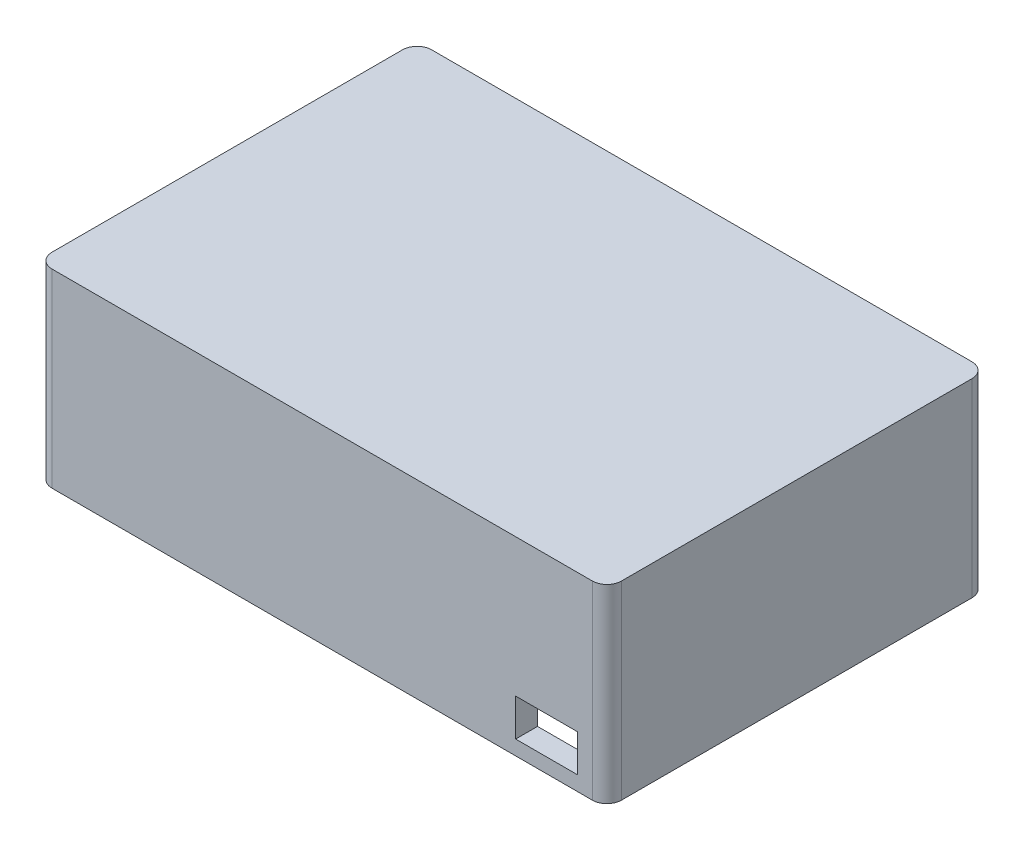
ISO-10303-21;
HEADER;
FILE_DESCRIPTION(('STEP AP214'),'2;1');
FILE_NAME('part.step','',(''),(''),'','','');
FILE_SCHEMA(('AUTOMOTIVE_DESIGN { 1 0 10303 214 1 1 1 1 }'));
ENDSEC;
DATA;
#1=APPLICATION_CONTEXT('core data for automotive mechanical design processes');
#2=APPLICATION_PROTOCOL_DEFINITION('international standard','automotive_design',2000,#1);
#3=PRODUCT_CONTEXT('',#1,'mechanical');
#4=PRODUCT('Part','Part','',(#3));
#5=PRODUCT_RELATED_PRODUCT_CATEGORY('part','',(#4));
#6=PRODUCT_DEFINITION_FORMATION('','',#4);
#7=PRODUCT_DEFINITION_CONTEXT('part definition',#1,'design');
#8=PRODUCT_DEFINITION('design','',#6,#7);
#9=PRODUCT_DEFINITION_SHAPE('','',#8);
#10=(LENGTH_UNIT() NAMED_UNIT(*) SI_UNIT(.MILLI.,.METRE.));
#11=(NAMED_UNIT(*) PLANE_ANGLE_UNIT() SI_UNIT($,.RADIAN.));
#12=(NAMED_UNIT(*) SI_UNIT($,.STERADIAN.) SOLID_ANGLE_UNIT());
#13=UNCERTAINTY_MEASURE_WITH_UNIT(LENGTH_MEASURE(1.E-05),#10,'distance_accuracy_value','');
#14=(GEOMETRIC_REPRESENTATION_CONTEXT(3) GLOBAL_UNCERTAINTY_ASSIGNED_CONTEXT((#13)) GLOBAL_UNIT_ASSIGNED_CONTEXT((#10,
#11,#12)) REPRESENTATION_CONTEXT('',''));
#15=CARTESIAN_POINT('',(0.,0.,0.));
#16=DIRECTION('',(0.,0.,1.));
#17=DIRECTION('',(1.,0.,0.));
#18=AXIS2_PLACEMENT_3D('',#15,#16,#17);
#19=CARTESIAN_POINT('',(-51.6247970479705,33.02,-27.9950645756457));
#20=DIRECTION('',(1.,0.,0.));
#21=DIRECTION('',(0.,0.,-1.));
#22=AXIS2_PLACEMENT_3D('',#19,#20,#21);
#23=PLANE('',#22);
#24=DIRECTION('',(0.,0.,1.));
#25=VECTOR('',#24,1.);
#26=CARTESIAN_POINT('',(-51.6247970479705,0.,-27.9950645756457));
#27=LINE('',#26,#25);
#28=CARTESIAN_POINT('',(-51.6247970479705,0.,-25.4550645756457));
#29=VERTEX_POINT('',#28);
#30=CARTESIAN_POINT('',(-51.6247970479705,0.,35.5049354243543));
#31=VERTEX_POINT('',#30);
#32=EDGE_CURVE('E296',#29,#31,#27,.T.);
#33=ORIENTED_EDGE('',*,*,#32,.T.);
#34=DIRECTION('',(0.,-1.,0.));
#35=VECTOR('',#34,1.);
#36=CARTESIAN_POINT('',(-51.6247970479705,33.02,35.5049354243543));
#37=LINE('',#36,#35);
#38=CARTESIAN_POINT('',(-51.6247970479705,33.02,35.5049354243543));
#39=VERTEX_POINT('',#38);
#40=EDGE_CURVE('E345',#31,#39,#37,.F.);
#41=ORIENTED_EDGE('',*,*,#40,.T.);
#42=DIRECTION('',(0.,0.,1.));
#43=VECTOR('',#42,1.);
#44=CARTESIAN_POINT('',(-51.6247970479705,33.02,-27.9950645756457));
#45=LINE('',#44,#43);
#46=CARTESIAN_POINT('',(-51.6247970479705,33.02,-25.4550645756457));
#47=VERTEX_POINT('',#46);
#48=EDGE_CURVE('E306',#47,#39,#45,.T.);
#49=ORIENTED_EDGE('',*,*,#48,.F.);
#50=DIRECTION('',(0.,-1.,0.));
#51=VECTOR('',#50,1.);
#52=CARTESIAN_POINT('',(-51.6247970479705,33.02,-25.4550645756457));
#53=LINE('',#52,#51);
#54=EDGE_CURVE('E342',#47,#29,#53,.T.);
#55=ORIENTED_EDGE('',*,*,#54,.T.);
#56=EDGE_LOOP('',(#33,#41,#49,#55));
#57=FACE_BOUND('',#56,.T.);
#58=ADVANCED_FACE('F33',(#57),#23,.F.);
#59=CARTESIAN_POINT('',(-51.6247970479705,33.02,38.0449354243543));
#60=DIRECTION('',(0.,0.,-1.));
#61=DIRECTION('',(-1.,0.,0.));
#62=AXIS2_PLACEMENT_3D('',#59,#60,#61);
#63=PLANE('',#62);
#64=DIRECTION('',(-1.,0.,0.));
#65=VECTOR('',#64,1.);
#66=CARTESIAN_POINT('',(42.3552029520296,9.017,38.0449354243543));
#67=LINE('',#66,#65);
#68=CARTESIAN_POINT('',(42.3552029520296,9.017,38.0449354243543));
#69=VERTEX_POINT('',#68);
#70=CARTESIAN_POINT('',(31.5602029520296,9.017,38.0449354243543));
#71=VERTEX_POINT('',#70);
#72=EDGE_CURVE('E199',#69,#71,#67,.T.);
#73=ORIENTED_EDGE('',*,*,#72,.F.);
#74=DIRECTION('',(0.,1.,0.));
#75=VECTOR('',#74,1.);
#76=CARTESIAN_POINT('',(42.3552029520296,2.54,38.0449354243543));
#77=LINE('',#76,#75);
#78=CARTESIAN_POINT('',(42.3552029520296,2.54,38.0449354243543));
#79=VERTEX_POINT('',#78);
#80=EDGE_CURVE('E48',#79,#69,#77,.T.);
#81=ORIENTED_EDGE('',*,*,#80,.F.);
#82=DIRECTION('',(1.,0.,0.));
#83=VECTOR('',#82,1.);
#84=CARTESIAN_POINT('',(42.3552029520296,2.54,38.0449354243543));
#85=LINE('',#84,#83);
#86=CARTESIAN_POINT('',(31.5602029520296,2.54,38.0449354243543));
#87=VERTEX_POINT('',#86);
#88=EDGE_CURVE('E186',#87,#79,#85,.T.);
#89=ORIENTED_EDGE('',*,*,#88,.F.);
#90=DIRECTION('',(0.,-1.,0.));
#91=VECTOR('',#90,1.);
#92=CARTESIAN_POINT('',(31.5602029520296,2.54,38.0449354243543));
#93=LINE('',#92,#91);
#94=EDGE_CURVE('E193',#71,#87,#93,.T.);
#95=ORIENTED_EDGE('',*,*,#94,.F.);
#96=EDGE_LOOP('',(#73,#81,#89,#95));
#97=FACE_BOUND('',#96,.T.);
#98=DIRECTION('',(1.,0.,0.));
#99=VECTOR('',#98,1.);
#100=CARTESIAN_POINT('',(-51.6247970479705,33.02,38.0449354243543));
#101=LINE('',#100,#99);
#102=CARTESIAN_POINT('',(-49.0847970479705,33.02,38.0449354243543));
#103=VERTEX_POINT('',#102);
#104=CARTESIAN_POINT('',(44.8952029520296,33.02,38.0449354243543));
#105=VERTEX_POINT('',#104);
#106=EDGE_CURVE('E309',#103,#105,#101,.T.);
#107=ORIENTED_EDGE('',*,*,#106,.F.);
#108=DIRECTION('',(0.,-1.,0.));
#109=VECTOR('',#108,1.);
#110=CARTESIAN_POINT('',(-49.0847970479705,33.02,38.0449354243543));
#111=LINE('',#110,#109);
#112=CARTESIAN_POINT('',(-49.0847970479705,0.,38.0449354243543));
#113=VERTEX_POINT('',#112);
#114=EDGE_CURVE('E331',#103,#113,#111,.T.);
#115=ORIENTED_EDGE('',*,*,#114,.T.);
#116=DIRECTION('',(1.,0.,0.));
#117=VECTOR('',#116,1.);
#118=CARTESIAN_POINT('',(-51.6247970479705,0.,38.0449354243543));
#119=LINE('',#118,#117);
#120=CARTESIAN_POINT('',(44.8952029520296,0.,38.0449354243543));
#121=VERTEX_POINT('',#120);
#122=EDGE_CURVE('E322',#113,#121,#119,.T.);
#123=ORIENTED_EDGE('',*,*,#122,.T.);
#124=DIRECTION('',(0.,-1.,0.));
#125=VECTOR('',#124,1.);
#126=CARTESIAN_POINT('',(44.8952029520296,33.02,38.0449354243543));
#127=LINE('',#126,#125);
#128=EDGE_CURVE('E319',#121,#105,#127,.F.);
#129=ORIENTED_EDGE('',*,*,#128,.T.);
#130=EDGE_LOOP('',(#107,#115,#123,#129));
#131=FACE_BOUND('',#130,.T.);
#132=ADVANCED_FACE('F196',(#97,#131),#63,.F.);
#133=CARTESIAN_POINT('',(47.4352029520295,33.02,-27.9950645756457));
#134=DIRECTION('',(-1.,0.,0.));
#135=DIRECTION('',(0.,0.,1.));
#136=AXIS2_PLACEMENT_3D('',#133,#134,#135);
#137=PLANE('',#136);
#138=DIRECTION('',(0.,0.,-1.));
#139=VECTOR('',#138,1.);
#140=CARTESIAN_POINT('',(47.4352029520295,0.,-27.9950645756457));
#141=LINE('',#140,#139);
#142=CARTESIAN_POINT('',(47.4352029520296,0.,35.5049354243543));
#143=VERTEX_POINT('',#142);
#144=CARTESIAN_POINT('',(47.4352029520295,0.,-25.4550645756457));
#145=VERTEX_POINT('',#144);
#146=EDGE_CURVE('E325',#143,#145,#141,.T.);
#147=ORIENTED_EDGE('',*,*,#146,.T.);
#148=DIRECTION('',(0.,-1.,0.));
#149=VECTOR('',#148,1.);
#150=CARTESIAN_POINT('',(47.4352029520295,33.02,-25.4550645756457));
#151=LINE('',#150,#149);
#152=CARTESIAN_POINT('',(47.4352029520295,33.02,-25.4550645756457));
#153=VERTEX_POINT('',#152);
#154=EDGE_CURVE('E11',#145,#153,#151,.F.);
#155=ORIENTED_EDGE('',*,*,#154,.T.);
#156=DIRECTION('',(0.,0.,-1.));
#157=VECTOR('',#156,1.);
#158=CARTESIAN_POINT('',(47.4352029520295,33.02,-27.9950645756457));
#159=LINE('',#158,#157);
#160=CARTESIAN_POINT('',(47.4352029520296,33.02,35.5049354243543));
#161=VERTEX_POINT('',#160);
#162=EDGE_CURVE('E313',#161,#153,#159,.T.);
#163=ORIENTED_EDGE('',*,*,#162,.F.);
#164=DIRECTION('',(0.,-1.,0.));
#165=VECTOR('',#164,1.);
#166=CARTESIAN_POINT('',(47.4352029520296,33.02,35.5049354243543));
#167=LINE('',#166,#165);
#168=EDGE_CURVE('E41',#161,#143,#167,.T.);
#169=ORIENTED_EDGE('',*,*,#168,.T.);
#170=EDGE_LOOP('',(#147,#155,#163,#169));
#171=FACE_BOUND('',#170,.T.);
#172=ADVANCED_FACE('F364',(#171),#137,.F.);
#173=CARTESIAN_POINT('',(-51.6247970479705,33.02,-27.9950645756457));
#174=DIRECTION('',(0.,0.,1.));
#175=DIRECTION('',(1.,0.,0.));
#176=AXIS2_PLACEMENT_3D('',#173,#174,#175);
#177=PLANE('',#176);
#178=DIRECTION('',(-1.,0.,0.));
#179=VECTOR('',#178,1.);
#180=CARTESIAN_POINT('',(-51.6247970479705,0.,-27.9950645756457));
#181=LINE('',#180,#179);
#182=CARTESIAN_POINT('',(44.8952029520295,0.,-27.9950645756457));
#183=VERTEX_POINT('',#182);
#184=CARTESIAN_POINT('',(-49.0847970479705,0.,-27.9950645756457));
#185=VERTEX_POINT('',#184);
#186=EDGE_CURVE('E310',#183,#185,#181,.T.);
#187=ORIENTED_EDGE('',*,*,#186,.T.);
#188=DIRECTION('',(0.,-1.,0.));
#189=VECTOR('',#188,1.);
#190=CARTESIAN_POINT('',(-49.0847970479705,33.02,-27.9950645756457));
#191=LINE('',#190,#189);
#192=CARTESIAN_POINT('',(-49.0847970479705,33.02,-27.9950645756457));
#193=VERTEX_POINT('',#192);
#194=EDGE_CURVE('E358',#185,#193,#191,.F.);
#195=ORIENTED_EDGE('',*,*,#194,.T.);
#196=DIRECTION('',(-1.,0.,0.));
#197=VECTOR('',#196,1.);
#198=CARTESIAN_POINT('',(-51.6247970479705,33.02,-27.9950645756457));
#199=LINE('',#198,#197);
#200=CARTESIAN_POINT('',(44.8952029520295,33.02,-27.9950645756457));
#201=VERTEX_POINT('',#200);
#202=EDGE_CURVE('E316',#201,#193,#199,.T.);
#203=ORIENTED_EDGE('',*,*,#202,.F.);
#204=DIRECTION('',(0.,-1.,0.));
#205=VECTOR('',#204,1.);
#206=CARTESIAN_POINT('',(44.8952029520295,33.02,-27.9950645756457));
#207=LINE('',#206,#205);
#208=EDGE_CURVE('E355',#201,#183,#207,.T.);
#209=ORIENTED_EDGE('',*,*,#208,.T.);
#210=EDGE_LOOP('',(#187,#195,#203,#209));
#211=FACE_BOUND('',#210,.T.);
#212=ADVANCED_FACE('F378',(#211),#177,.F.);
#213=CARTESIAN_POINT('',(0.,33.02,0.));
#214=DIRECTION('',(0.,1.,0.));
#215=DIRECTION('',(0.,0.,1.));
#216=AXIS2_PLACEMENT_3D('',#213,#214,#215);
#217=PLANE('',#216);
#218=ORIENTED_EDGE('',*,*,#48,.T.);
#219=CARTESIAN_POINT('',(-49.0847970479705,33.02,35.5049354243543));
#220=DIRECTION('',(0.,1.,0.));
#221=DIRECTION('',(0.,0.,1.));
#222=AXIS2_PLACEMENT_3D('',#219,#220,#221);
#223=CIRCLE('',#222,2.54);
#224=EDGE_CURVE('E353',#39,#103,#223,.T.);
#225=ORIENTED_EDGE('',*,*,#224,.T.);
#226=ORIENTED_EDGE('',*,*,#106,.T.);
#227=CARTESIAN_POINT('',(44.8952029520296,33.02,35.5049354243543));
#228=DIRECTION('',(0.,1.,0.));
#229=DIRECTION('',(0.,0.,1.));
#230=AXIS2_PLACEMENT_3D('',#227,#228,#229);
#231=CIRCLE('',#230,2.54);
#232=EDGE_CURVE('E347',#105,#161,#231,.T.);
#233=ORIENTED_EDGE('',*,*,#232,.T.);
#234=ORIENTED_EDGE('',*,*,#162,.T.);
#235=CARTESIAN_POINT('',(44.8952029520295,33.02,-25.4550645756457));
#236=DIRECTION('',(0.,1.,0.));
#237=DIRECTION('',(0.,0.,1.));
#238=AXIS2_PLACEMENT_3D('',#235,#236,#237);
#239=CIRCLE('',#238,2.54);
#240=EDGE_CURVE('E349',#153,#201,#239,.T.);
#241=ORIENTED_EDGE('',*,*,#240,.T.);
#242=ORIENTED_EDGE('',*,*,#202,.T.);
#243=CARTESIAN_POINT('',(-49.0847970479705,33.02,-25.4550645756457));
#244=DIRECTION('',(0.,1.,0.));
#245=DIRECTION('',(0.,0.,1.));
#246=AXIS2_PLACEMENT_3D('',#243,#244,#245);
#247=CIRCLE('',#246,2.54);
#248=EDGE_CURVE('E351',#193,#47,#247,.T.);
#249=ORIENTED_EDGE('',*,*,#248,.T.);
#250=EDGE_LOOP('',(#218,#225,#226,#233,#234,#241,#242,#249));
#251=FACE_BOUND('',#250,.T.);
#252=ADVANCED_FACE('F382',(#251),#217,.T.);
#253=CARTESIAN_POINT('',(0.,0.,0.));
#254=DIRECTION('',(0.,1.,0.));
#255=DIRECTION('',(0.,0.,1.));
#256=AXIS2_PLACEMENT_3D('',#253,#254,#255);
#257=PLANE('',#256);
#258=CARTESIAN_POINT('',(44.2602029520296,0.,-24.8200645756457));
#259=DIRECTION('',(0.,-1.,0.));
#260=DIRECTION('',(0.,0.,-1.));
#261=AXIS2_PLACEMENT_3D('',#258,#259,#260);
#262=CIRCLE('',#261,1.190625);
#263=CARTESIAN_POINT('',(44.2602029520296,0.,-26.0106895756457));
#264=VERTEX_POINT('',#263);
#265=EDGE_CURVE('E216',#264,#264,#262,.T.);
#266=ORIENTED_EDGE('',*,*,#265,.F.);
#267=EDGE_LOOP('',(#266));
#268=FACE_BOUND('',#267,.T.);
#269=CARTESIAN_POINT('',(-48.4497970479705,0.,34.8699354243542));
#270=DIRECTION('',(0.,-1.,0.));
#271=DIRECTION('',(0.,0.,-1.));
#272=AXIS2_PLACEMENT_3D('',#269,#270,#271);
#273=CIRCLE('',#272,1.190625);
#274=CARTESIAN_POINT('',(-48.4497970479705,0.,33.6793104243542));
#275=VERTEX_POINT('',#274);
#276=EDGE_CURVE('E223',#275,#275,#273,.T.);
#277=ORIENTED_EDGE('',*,*,#276,.F.);
#278=EDGE_LOOP('',(#277));
#279=FACE_BOUND('',#278,.T.);
#280=CARTESIAN_POINT('',(-48.4497970479704,0.,-24.8200645756457));
#281=DIRECTION('',(0.,-1.,0.));
#282=DIRECTION('',(0.,0.,-1.));
#283=AXIS2_PLACEMENT_3D('',#280,#281,#282);
#284=CIRCLE('',#283,1.190625);
#285=CARTESIAN_POINT('',(-48.4497970479704,0.,-26.0106895756457));
#286=VERTEX_POINT('',#285);
#287=EDGE_CURVE('E229',#286,#286,#284,.T.);
#288=ORIENTED_EDGE('',*,*,#287,.F.);
#289=EDGE_LOOP('',(#288));
#290=FACE_BOUND('',#289,.T.);
#291=CARTESIAN_POINT('',(44.2602029520296,0.,34.8699354243543));
#292=DIRECTION('',(0.,-1.,0.));
#293=DIRECTION('',(0.,0.,-1.));
#294=AXIS2_PLACEMENT_3D('',#291,#292,#293);
#295=CIRCLE('',#294,1.190625);
#296=CARTESIAN_POINT('',(44.2602029520296,0.,33.6793104243542));
#297=VERTEX_POINT('',#296);
#298=EDGE_CURVE('E219',#297,#297,#295,.T.);
#299=ORIENTED_EDGE('',*,*,#298,.F.);
#300=EDGE_LOOP('',(#299));
#301=FACE_BOUND('',#300,.T.);
#302=DIRECTION('',(0.,0.,1.));
#303=VECTOR('',#302,1.);
#304=CARTESIAN_POINT('',(43.6252029520296,0.,34.2349354243543));
#305=LINE('',#304,#303);
#306=CARTESIAN_POINT('',(43.6252029520296,0.,-21.6450645756457));
#307=VERTEX_POINT('',#306);
#308=CARTESIAN_POINT('',(43.6252029520296,0.,31.6949354243542));
#309=VERTEX_POINT('',#308);
#310=EDGE_CURVE('E283',#307,#309,#305,.T.);
#311=ORIENTED_EDGE('',*,*,#310,.F.);
#312=CARTESIAN_POINT('',(43.6252029520296,0.,-24.1850645756457));
#313=DIRECTION('',(0.,-1.,0.));
#314=DIRECTION('',(0.,0.,-1.));
#315=AXIS2_PLACEMENT_3D('',#312,#313,#314);
#316=CIRCLE('',#315,2.54000000000001);
#317=CARTESIAN_POINT('',(41.0852029520296,0.,-24.1850645756457));
#318=VERTEX_POINT('',#317);
#319=EDGE_CURVE('E238',#307,#318,#316,.T.);
#320=ORIENTED_EDGE('',*,*,#319,.T.);
#321=DIRECTION('',(1.,0.,0.));
#322=VECTOR('',#321,1.);
#323=CARTESIAN_POINT('',(43.6252029520296,0.,-24.1850645756457));
#324=LINE('',#323,#322);
#325=CARTESIAN_POINT('',(-45.2747970479704,0.,-24.1850645756458));
#326=VERTEX_POINT('',#325);
#327=EDGE_CURVE('E287',#326,#318,#324,.T.);
#328=ORIENTED_EDGE('',*,*,#327,.F.);
#329=CARTESIAN_POINT('',(-47.8147970479705,0.,-24.1850645756457));
#330=DIRECTION('',(0.,-1.,0.));
#331=DIRECTION('',(0.,0.,-1.));
#332=AXIS2_PLACEMENT_3D('',#329,#330,#331);
#333=CIRCLE('',#332,2.54000000000001);
#334=CARTESIAN_POINT('',(-47.8147970479704,0.,-21.6450645756457));
#335=VERTEX_POINT('',#334);
#336=EDGE_CURVE('E250',#326,#335,#333,.T.);
#337=ORIENTED_EDGE('',*,*,#336,.T.);
#338=DIRECTION('',(0.,0.,-1.));
#339=VECTOR('',#338,1.);
#340=CARTESIAN_POINT('',(-47.8147970479704,0.,34.2349354243542));
#341=LINE('',#340,#339);
#342=CARTESIAN_POINT('',(-47.8147970479704,0.,31.6949354243542));
#343=VERTEX_POINT('',#342);
#344=EDGE_CURVE('E301',#343,#335,#341,.T.);
#345=ORIENTED_EDGE('',*,*,#344,.F.);
#346=CARTESIAN_POINT('',(-47.8147970479704,0.,34.2349354243542));
#347=DIRECTION('',(0.,-1.,0.));
#348=DIRECTION('',(0.,0.,-1.));
#349=AXIS2_PLACEMENT_3D('',#346,#347,#348);
#350=CIRCLE('',#349,2.54000000000001);
#351=CARTESIAN_POINT('',(-45.2747970479704,0.,34.2349354243543));
#352=VERTEX_POINT('',#351);
#353=EDGE_CURVE('E260',#343,#352,#350,.T.);
#354=ORIENTED_EDGE('',*,*,#353,.T.);
#355=DIRECTION('',(-1.,0.,0.));
#356=VECTOR('',#355,1.);
#357=CARTESIAN_POINT('',(43.6252029520296,0.,34.2349354243543));
#358=LINE('',#357,#356);
#359=CARTESIAN_POINT('',(41.0852029520296,0.,34.2349354243543));
#360=VERTEX_POINT('',#359);
#361=EDGE_CURVE('E298',#360,#352,#358,.T.);
#362=ORIENTED_EDGE('',*,*,#361,.F.);
#363=CARTESIAN_POINT('',(43.6252029520296,0.,34.2349354243543));
#364=DIRECTION('',(0.,-1.,0.));
#365=DIRECTION('',(0.,0.,1.));
#366=AXIS2_PLACEMENT_3D('',#363,#364,#365);
#367=CIRCLE('',#366,2.54000000000001);
#368=EDGE_CURVE('E270',#360,#309,#367,.T.);
#369=ORIENTED_EDGE('',*,*,#368,.T.);
#370=EDGE_LOOP('',(#311,#320,#328,#337,#345,#354,#362,#369));
#371=FACE_BOUND('',#370,.T.);
#372=ORIENTED_EDGE('',*,*,#122,.F.);
#373=CARTESIAN_POINT('',(-49.0847970479705,0.,35.5049354243543));
#374=DIRECTION('',(0.,1.,0.));
#375=DIRECTION('',(0.,0.,1.));
#376=AXIS2_PLACEMENT_3D('',#373,#374,#375);
#377=CIRCLE('',#376,2.54);
#378=EDGE_CURVE('E340',#113,#31,#377,.F.);
#379=ORIENTED_EDGE('',*,*,#378,.T.);
#380=ORIENTED_EDGE('',*,*,#32,.F.);
#381=CARTESIAN_POINT('',(-49.0847970479705,0.,-25.4550645756457));
#382=DIRECTION('',(0.,1.,0.));
#383=DIRECTION('',(0.,0.,1.));
#384=AXIS2_PLACEMENT_3D('',#381,#382,#383);
#385=CIRCLE('',#384,2.54);
#386=EDGE_CURVE('E338',#29,#185,#385,.F.);
#387=ORIENTED_EDGE('',*,*,#386,.T.);
#388=ORIENTED_EDGE('',*,*,#186,.F.);
#389=CARTESIAN_POINT('',(44.8952029520295,0.,-25.4550645756457));
#390=DIRECTION('',(0.,1.,0.));
#391=DIRECTION('',(0.,0.,1.));
#392=AXIS2_PLACEMENT_3D('',#389,#390,#391);
#393=CIRCLE('',#392,2.54);
#394=EDGE_CURVE('E336',#183,#145,#393,.F.);
#395=ORIENTED_EDGE('',*,*,#394,.T.);
#396=ORIENTED_EDGE('',*,*,#146,.F.);
#397=CARTESIAN_POINT('',(44.8952029520296,0.,35.5049354243543));
#398=DIRECTION('',(0.,1.,0.));
#399=DIRECTION('',(0.,0.,1.));
#400=AXIS2_PLACEMENT_3D('',#397,#398,#399);
#401=CIRCLE('',#400,2.54);
#402=EDGE_CURVE('E334',#143,#121,#401,.F.);
#403=ORIENTED_EDGE('',*,*,#402,.T.);
#404=EDGE_LOOP('',(#372,#379,#380,#387,#388,#395,#396,#403));
#405=FACE_BOUND('',#404,.T.);
#406=ADVANCED_FACE('F370',(#268,#279,#290,#301,#371,#405),#257,.F.);
#407=CARTESIAN_POINT('',(-49.0847970479705,33.02,35.5049354243543));
#408=DIRECTION('',(0.,-1.,0.));
#409=DIRECTION('',(0.,0.,-1.));
#410=AXIS2_PLACEMENT_3D('',#407,#408,#409);
#411=CYLINDRICAL_SURFACE('',#410,2.54);
#412=ORIENTED_EDGE('',*,*,#224,.F.);
#413=ORIENTED_EDGE('',*,*,#40,.F.);
#414=ORIENTED_EDGE('',*,*,#378,.F.);
#415=ORIENTED_EDGE('',*,*,#114,.F.);
#416=EDGE_LOOP('',(#412,#413,#414,#415));
#417=FACE_BOUND('',#416,.T.);
#418=ADVANCED_FACE('F393',(#417),#411,.T.);
#419=CARTESIAN_POINT('',(-49.0847970479705,33.02,-25.4550645756457));
#420=DIRECTION('',(0.,-1.,0.));
#421=DIRECTION('',(0.,0.,-1.));
#422=AXIS2_PLACEMENT_3D('',#419,#420,#421);
#423=CYLINDRICAL_SURFACE('',#422,2.54);
#424=ORIENTED_EDGE('',*,*,#248,.F.);
#425=ORIENTED_EDGE('',*,*,#194,.F.);
#426=ORIENTED_EDGE('',*,*,#386,.F.);
#427=ORIENTED_EDGE('',*,*,#54,.F.);
#428=EDGE_LOOP('',(#424,#425,#426,#427));
#429=FACE_BOUND('',#428,.T.);
#430=ADVANCED_FACE('F386',(#429),#423,.T.);
#431=CARTESIAN_POINT('',(44.8952029520295,33.02,-25.4550645756457));
#432=DIRECTION('',(0.,-1.,0.));
#433=DIRECTION('',(0.,0.,-1.));
#434=AXIS2_PLACEMENT_3D('',#431,#432,#433);
#435=CYLINDRICAL_SURFACE('',#434,2.54);
#436=ORIENTED_EDGE('',*,*,#240,.F.);
#437=ORIENTED_EDGE('',*,*,#154,.F.);
#438=ORIENTED_EDGE('',*,*,#394,.F.);
#439=ORIENTED_EDGE('',*,*,#208,.F.);
#440=EDGE_LOOP('',(#436,#437,#438,#439));
#441=FACE_BOUND('',#440,.T.);
#442=ADVANCED_FACE('F375',(#441),#435,.T.);
#443=CARTESIAN_POINT('',(44.8952029520296,33.02,35.5049354243543));
#444=DIRECTION('',(0.,-1.,0.));
#445=DIRECTION('',(0.,0.,-1.));
#446=AXIS2_PLACEMENT_3D('',#443,#444,#445);
#447=CYLINDRICAL_SURFACE('',#446,2.54);
#448=ORIENTED_EDGE('',*,*,#232,.F.);
#449=ORIENTED_EDGE('',*,*,#128,.F.);
#450=ORIENTED_EDGE('',*,*,#402,.F.);
#451=ORIENTED_EDGE('',*,*,#168,.F.);
#452=EDGE_LOOP('',(#448,#449,#450,#451));
#453=FACE_BOUND('',#452,.T.);
#454=ADVANCED_FACE('F35',(#453),#447,.T.);
#455=CARTESIAN_POINT('',(43.6252029520296,30.48,34.2349354243543));
#456=DIRECTION('',(1.,0.,0.));
#457=DIRECTION('',(0.,0.,-1.));
#458=AXIS2_PLACEMENT_3D('',#455,#456,#457);
#459=PLANE('',#458);
#460=DIRECTION('',(0.,0.,1.));
#461=VECTOR('',#460,1.);
#462=CARTESIAN_POINT('',(43.6252029520296,30.48,34.2349354243543));
#463=LINE('',#462,#461);
#464=CARTESIAN_POINT('',(43.6252029520296,30.48,-21.6450645756457));
#465=VERTEX_POINT('',#464);
#466=CARTESIAN_POINT('',(43.6252029520296,30.4800000001251,31.6949354243542));
#467=VERTEX_POINT('',#466);
#468=EDGE_CURVE('E284',#465,#467,#463,.T.);
#469=ORIENTED_EDGE('',*,*,#468,.F.);
#470=DIRECTION('',(0.,-1.,0.));
#471=VECTOR('',#470,1.);
#472=CARTESIAN_POINT('',(43.6252029520296,500000.,-21.6450645756457));
#473=LINE('',#472,#471);
#474=EDGE_CURVE('E244',#465,#307,#473,.T.);
#475=ORIENTED_EDGE('',*,*,#474,.T.);
#476=ORIENTED_EDGE('',*,*,#310,.T.);
#477=DIRECTION('',(0.,-1.,0.));
#478=VECTOR('',#477,1.);
#479=CARTESIAN_POINT('',(43.6252029520296,500000.,31.6949354243542));
#480=LINE('',#479,#478);
#481=EDGE_CURVE('E277',#467,#309,#480,.T.);
#482=ORIENTED_EDGE('',*,*,#481,.F.);
#483=EDGE_LOOP('',(#469,#475,#476,#482));
#484=FACE_BOUND('',#483,.T.);
#485=ADVANCED_FACE('F397',(#484),#459,.F.);
#486=CARTESIAN_POINT('',(43.6252029520296,30.48,-24.1850645756457));
#487=DIRECTION('',(0.,0.,-1.));
#488=DIRECTION('',(-1.,0.,0.));
#489=AXIS2_PLACEMENT_3D('',#486,#487,#488);
#490=PLANE('',#489);
#491=ORIENTED_EDGE('',*,*,#327,.T.);
#492=DIRECTION('',(0.,-1.,0.));
#493=VECTOR('',#492,1.);
#494=CARTESIAN_POINT('',(41.0852029520296,500000.,-24.1850645756457));
#495=LINE('',#494,#493);
#496=CARTESIAN_POINT('',(41.0852029520296,30.4800000001251,-24.1850645756457));
#497=VERTEX_POINT('',#496);
#498=EDGE_CURVE('E243',#497,#318,#495,.T.);
#499=ORIENTED_EDGE('',*,*,#498,.F.);
#500=DIRECTION('',(1.,0.,0.));
#501=VECTOR('',#500,1.);
#502=CARTESIAN_POINT('',(43.6252029520296,30.48,-24.1850645756457));
#503=LINE('',#502,#501);
#504=CARTESIAN_POINT('',(-45.2747970479704,30.48,-24.1850645756457));
#505=VERTEX_POINT('',#504);
#506=EDGE_CURVE('E293',#505,#497,#503,.T.);
#507=ORIENTED_EDGE('',*,*,#506,.F.);
#508=DIRECTION('',(0.,-1.,0.));
#509=VECTOR('',#508,1.);
#510=CARTESIAN_POINT('',(-45.2747970479704,500000.,-24.1850645756458));
#511=LINE('',#510,#509);
#512=EDGE_CURVE('E254',#505,#326,#511,.T.);
#513=ORIENTED_EDGE('',*,*,#512,.T.);
#514=EDGE_LOOP('',(#491,#499,#507,#513));
#515=FACE_BOUND('',#514,.T.);
#516=ADVANCED_FACE('F402',(#515),#490,.F.);
#517=CARTESIAN_POINT('',(-47.8147970479704,30.48,34.2349354243542));
#518=DIRECTION('',(-1.,0.,0.));
#519=DIRECTION('',(0.,0.,1.));
#520=AXIS2_PLACEMENT_3D('',#517,#518,#519);
#521=PLANE('',#520);
#522=ORIENTED_EDGE('',*,*,#344,.T.);
#523=DIRECTION('',(0.,-1.,0.));
#524=VECTOR('',#523,1.);
#525=CARTESIAN_POINT('',(-47.8147970479704,500000.,-21.6450645756457));
#526=LINE('',#525,#524);
#527=CARTESIAN_POINT('',(-47.8147970479704,30.4800000001251,-21.6450645756457));
#528=VERTEX_POINT('',#527);
#529=EDGE_CURVE('E253',#528,#335,#526,.T.);
#530=ORIENTED_EDGE('',*,*,#529,.F.);
#531=DIRECTION('',(0.,0.,-1.));
#532=VECTOR('',#531,1.);
#533=CARTESIAN_POINT('',(-47.8147970479704,30.48,34.2349354243542));
#534=LINE('',#533,#532);
#535=CARTESIAN_POINT('',(-47.8147970479704,30.4800000000114,31.6949354243542));
#536=VERTEX_POINT('',#535);
#537=EDGE_CURVE('E290',#536,#528,#534,.T.);
#538=ORIENTED_EDGE('',*,*,#537,.F.);
#539=DIRECTION('',(0.,-1.,0.));
#540=VECTOR('',#539,1.);
#541=CARTESIAN_POINT('',(-47.8147970479704,500000.,31.6949354243542));
#542=LINE('',#541,#540);
#543=EDGE_CURVE('E264',#536,#343,#542,.T.);
#544=ORIENTED_EDGE('',*,*,#543,.T.);
#545=EDGE_LOOP('',(#522,#530,#538,#544));
#546=FACE_BOUND('',#545,.T.);
#547=ADVANCED_FACE('F444',(#546),#521,.F.);
#548=CARTESIAN_POINT('',(43.6252029520296,30.48,34.2349354243543));
#549=DIRECTION('',(0.,0.,1.));
#550=DIRECTION('',(1.,0.,0.));
#551=AXIS2_PLACEMENT_3D('',#548,#549,#550);
#552=PLANE('',#551);
#553=DIRECTION('',(0.,1.,0.));
#554=VECTOR('',#553,1.);
#555=CARTESIAN_POINT('',(31.5602029520296,2.54,34.2349354243543));
#556=LINE('',#555,#554);
#557=CARTESIAN_POINT('',(31.5602029520296,2.54,34.2349354243543));
#558=VERTEX_POINT('',#557);
#559=CARTESIAN_POINT('',(31.5602029520296,9.017,34.2349354243543));
#560=VERTEX_POINT('',#559);
#561=EDGE_CURVE('E208',#558,#560,#556,.T.);
#562=ORIENTED_EDGE('',*,*,#561,.F.);
#563=DIRECTION('',(-1.,0.,0.));
#564=VECTOR('',#563,1.);
#565=CARTESIAN_POINT('',(42.3552029520296,2.54,34.2349354243543));
#566=LINE('',#565,#564);
#567=CARTESIAN_POINT('',(41.0852029520296,2.54000000012411,34.2349354243543));
#568=VERTEX_POINT('',#567);
#569=EDGE_CURVE('E192',#568,#558,#566,.T.);
#570=ORIENTED_EDGE('',*,*,#569,.F.);
#571=DIRECTION('',(0.,-1.,0.));
#572=VECTOR('',#571,1.);
#573=CARTESIAN_POINT('',(41.0852029520296,500000.,34.2349354243543));
#574=LINE('',#573,#572);
#575=EDGE_CURVE('E273',#568,#360,#574,.T.);
#576=ORIENTED_EDGE('',*,*,#575,.T.);
#577=ORIENTED_EDGE('',*,*,#361,.T.);
#578=DIRECTION('',(0.,-1.,0.));
#579=VECTOR('',#578,1.);
#580=CARTESIAN_POINT('',(-45.2747970479704,500000.,34.2349354243543));
#581=LINE('',#580,#579);
#582=CARTESIAN_POINT('',(-45.2747970479704,30.4800000001251,34.2349354243543));
#583=VERTEX_POINT('',#582);
#584=EDGE_CURVE('E263',#583,#352,#581,.T.);
#585=ORIENTED_EDGE('',*,*,#584,.F.);
#586=DIRECTION('',(-1.,0.,0.));
#587=VECTOR('',#586,1.);
#588=CARTESIAN_POINT('',(43.6252029520296,30.48,34.2349354243543));
#589=LINE('',#588,#587);
#590=CARTESIAN_POINT('',(41.0852029520296,30.48,34.2349354243543));
#591=VERTEX_POINT('',#590);
#592=EDGE_CURVE('E286',#591,#583,#589,.T.);
#593=ORIENTED_EDGE('',*,*,#592,.F.);
#594=CARTESIAN_POINT('',(41.0852029520296,9.017000000199,34.2349354243543));
#595=VERTEX_POINT('',#594);
#596=EDGE_CURVE('E274',#591,#595,#574,.T.);
#597=ORIENTED_EDGE('',*,*,#596,.T.);
#598=DIRECTION('',(1.,0.,0.));
#599=VECTOR('',#598,1.);
#600=CARTESIAN_POINT('',(42.3552029520296,9.017,34.2349354243543));
#601=LINE('',#600,#599);
#602=EDGE_CURVE('E56',#560,#595,#601,.T.);
#603=ORIENTED_EDGE('',*,*,#602,.F.);
#604=EDGE_LOOP('',(#562,#570,#576,#577,#585,#593,#597,#603));
#605=FACE_BOUND('',#604,.T.);
#606=ADVANCED_FACE('F454',(#605),#552,.F.);
#607=CARTESIAN_POINT('',(0.,30.48,0.));
#608=DIRECTION('',(0.,1.,0.));
#609=DIRECTION('',(0.,0.,1.));
#610=AXIS2_PLACEMENT_3D('',#607,#608,#609);
#611=PLANE('',#610);
#612=ORIENTED_EDGE('',*,*,#506,.T.);
#613=CARTESIAN_POINT('',(43.6252029520296,30.4800000000114,-24.1850645756457));
#614=DIRECTION('',(0.,1.,0.));
#615=DIRECTION('',(0.,0.,1.));
#616=AXIS2_PLACEMENT_3D('',#613,#614,#615);
#617=CIRCLE('',#616,2.54000000000001);
#618=EDGE_CURVE('E247',#465,#497,#617,.F.);
#619=ORIENTED_EDGE('',*,*,#618,.F.);
#620=ORIENTED_EDGE('',*,*,#468,.T.);
#621=CARTESIAN_POINT('',(43.6252029520296,30.4800000000114,34.2349354243543));
#622=DIRECTION('',(0.,1.,0.));
#623=DIRECTION('',(0.,0.,1.));
#624=AXIS2_PLACEMENT_3D('',#621,#622,#623);
#625=CIRCLE('',#624,2.54000000000001);
#626=EDGE_CURVE('E280',#591,#467,#625,.F.);
#627=ORIENTED_EDGE('',*,*,#626,.F.);
#628=ORIENTED_EDGE('',*,*,#592,.T.);
#629=CARTESIAN_POINT('',(-47.8147970479704,30.4800000000114,34.2349354243542));
#630=DIRECTION('',(0.,1.,0.));
#631=DIRECTION('',(0.,0.,1.));
#632=AXIS2_PLACEMENT_3D('',#629,#630,#631);
#633=CIRCLE('',#632,2.54000000000001);
#634=EDGE_CURVE('E267',#536,#583,#633,.F.);
#635=ORIENTED_EDGE('',*,*,#634,.F.);
#636=ORIENTED_EDGE('',*,*,#537,.T.);
#637=CARTESIAN_POINT('',(-47.8147970479705,30.4800000000114,-24.1850645756457));
#638=DIRECTION('',(0.,1.,0.));
#639=DIRECTION('',(0.,0.,1.));
#640=AXIS2_PLACEMENT_3D('',#637,#638,#639);
#641=CIRCLE('',#640,2.54000000000001);
#642=EDGE_CURVE('E257',#505,#528,#641,.F.);
#643=ORIENTED_EDGE('',*,*,#642,.F.);
#644=EDGE_LOOP('',(#612,#619,#620,#627,#628,#635,#636,#643));
#645=FACE_BOUND('',#644,.T.);
#646=ADVANCED_FACE('F462',(#645),#611,.F.);
#647=CARTESIAN_POINT('',(43.6252029520296,500000.,34.2349354243543));
#648=DIRECTION('',(0.,-1.,0.));
#649=DIRECTION('',(0.,0.,-1.));
#650=AXIS2_PLACEMENT_3D('',#647,#648,#649);
#651=CYLINDRICAL_SURFACE('',#650,2.54000000000001);
#652=CARTESIAN_POINT('',(43.6252029520296,2.54000000001042,34.2349354243543));
#653=DIRECTION('',(0.,-1.,0.));
#654=DIRECTION('',(1.,0.,0.));
#655=AXIS2_PLACEMENT_3D('',#652,#653,#654);
#656=CIRCLE('',#655,2.54000000000001);
#657=CARTESIAN_POINT('',(42.3552029520296,2.54000000001042,32.0352308987418));
#658=VERTEX_POINT('',#657);
#659=EDGE_CURVE('E183',#568,#658,#656,.T.);
#660=ORIENTED_EDGE('',*,*,#659,.T.);
#661=DIRECTION('',(0.,-1.,0.));
#662=VECTOR('',#661,1.);
#663=CARTESIAN_POINT('',(42.3552029520296,500000.,32.0352308987418));
#664=LINE('',#663,#662);
#665=CARTESIAN_POINT('',(42.3552029520296,9.01699999997163,32.0352308987418));
#666=VERTEX_POINT('',#665);
#667=EDGE_CURVE('E179',#658,#666,#664,.F.);
#668=ORIENTED_EDGE('',*,*,#667,.T.);
#669=CARTESIAN_POINT('',(43.6252029520296,9.01699999997163,34.2349354243543));
#670=DIRECTION('',(0.,1.,0.));
#671=DIRECTION('',(-1.,0.,0.));
#672=AXIS2_PLACEMENT_3D('',#669,#670,#671);
#673=CIRCLE('',#672,2.54000000000001);
#674=EDGE_CURVE('E200',#666,#595,#673,.T.);
#675=ORIENTED_EDGE('',*,*,#674,.T.);
#676=ORIENTED_EDGE('',*,*,#596,.F.);
#677=ORIENTED_EDGE('',*,*,#626,.T.);
#678=ORIENTED_EDGE('',*,*,#481,.T.);
#679=ORIENTED_EDGE('',*,*,#368,.F.);
#680=ORIENTED_EDGE('',*,*,#575,.F.);
#681=EDGE_LOOP('',(#660,#668,#675,#676,#677,#678,#679,#680));
#682=FACE_BOUND('',#681,.T.);
#683=ADVANCED_FACE('F467',(#682),#651,.T.);
#684=CARTESIAN_POINT('',(-47.8147970479704,500000.,34.2349354243542));
#685=DIRECTION('',(0.,-1.,0.));
#686=DIRECTION('',(0.,0.,-1.));
#687=AXIS2_PLACEMENT_3D('',#684,#685,#686);
#688=CYLINDRICAL_SURFACE('',#687,2.54000000000001);
#689=ORIENTED_EDGE('',*,*,#543,.F.);
#690=ORIENTED_EDGE('',*,*,#634,.T.);
#691=ORIENTED_EDGE('',*,*,#584,.T.);
#692=ORIENTED_EDGE('',*,*,#353,.F.);
#693=EDGE_LOOP('',(#689,#690,#691,#692));
#694=FACE_BOUND('',#693,.T.);
#695=ADVANCED_FACE('F475',(#694),#688,.T.);
#696=CARTESIAN_POINT('',(-47.8147970479705,500000.,-24.1850645756457));
#697=DIRECTION('',(0.,-1.,0.));
#698=DIRECTION('',(0.,0.,-1.));
#699=AXIS2_PLACEMENT_3D('',#696,#697,#698);
#700=CYLINDRICAL_SURFACE('',#699,2.54000000000001);
#701=ORIENTED_EDGE('',*,*,#512,.F.);
#702=ORIENTED_EDGE('',*,*,#642,.T.);
#703=ORIENTED_EDGE('',*,*,#529,.T.);
#704=ORIENTED_EDGE('',*,*,#336,.F.);
#705=EDGE_LOOP('',(#701,#702,#703,#704));
#706=FACE_BOUND('',#705,.T.);
#707=ADVANCED_FACE('F480',(#706),#700,.T.);
#708=CARTESIAN_POINT('',(43.6252029520296,500000.,-24.1850645756457));
#709=DIRECTION('',(0.,-1.,0.));
#710=DIRECTION('',(0.,0.,-1.));
#711=AXIS2_PLACEMENT_3D('',#708,#709,#710);
#712=CYLINDRICAL_SURFACE('',#711,2.54000000000001);
#713=ORIENTED_EDGE('',*,*,#474,.F.);
#714=ORIENTED_EDGE('',*,*,#618,.T.);
#715=ORIENTED_EDGE('',*,*,#498,.T.);
#716=ORIENTED_EDGE('',*,*,#319,.F.);
#717=EDGE_LOOP('',(#713,#714,#715,#716));
#718=FACE_BOUND('',#717,.T.);
#719=ADVANCED_FACE('F491',(#718),#712,.T.);
#720=CARTESIAN_POINT('',(44.2602029520296,12.7,34.8699354243543));
#721=DIRECTION('',(0.,-1.,0.));
#722=DIRECTION('',(0.,0.,-1.));
#723=AXIS2_PLACEMENT_3D('',#720,#721,#722);
#724=CYLINDRICAL_SURFACE('',#723,1.190625);
#725=CARTESIAN_POINT('',(44.2602029520296,12.7,34.8699354243543));
#726=DIRECTION('',(0.,-1.,0.));
#727=DIRECTION('',(0.,0.,-1.));
#728=AXIS2_PLACEMENT_3D('',#725,#726,#727);
#729=CIRCLE('',#728,1.190625);
#730=CARTESIAN_POINT('',(44.2602029520296,12.7,33.6793104243542));
#731=VERTEX_POINT('',#730);
#732=EDGE_CURVE('E235',#731,#731,#729,.T.);
#733=ORIENTED_EDGE('',*,*,#732,.F.);
#734=EDGE_LOOP('',(#733));
#735=FACE_BOUND('',#734,.T.);
#736=ORIENTED_EDGE('',*,*,#298,.T.);
#737=EDGE_LOOP('',(#736));
#738=FACE_BOUND('',#737,.T.);
#739=ADVANCED_FACE('F501',(#735,#738),#724,.F.);
#740=CARTESIAN_POINT('',(44.2602029520296,12.7,34.8699354243543));
#741=DIRECTION('',(0.,-1.,0.));
#742=DIRECTION('',(0.,0.,-1.));
#743=AXIS2_PLACEMENT_3D('',#740,#741,#742);
#744=PLANE('',#743);
#745=ORIENTED_EDGE('',*,*,#732,.T.);
#746=EDGE_LOOP('',(#745));
#747=FACE_BOUND('',#746,.T.);
#748=ADVANCED_FACE('F521',(#747),#744,.T.);
#749=CARTESIAN_POINT('',(-48.4497970479704,12.7,-24.8200645756457));
#750=DIRECTION('',(0.,-1.,0.));
#751=DIRECTION('',(0.,0.,-1.));
#752=AXIS2_PLACEMENT_3D('',#749,#750,#751);
#753=CYLINDRICAL_SURFACE('',#752,1.190625);
#754=CARTESIAN_POINT('',(-48.4497970479704,12.7,-24.8200645756457));
#755=DIRECTION('',(0.,-1.,0.));
#756=DIRECTION('',(0.,0.,-1.));
#757=AXIS2_PLACEMENT_3D('',#754,#755,#756);
#758=CIRCLE('',#757,1.190625);
#759=CARTESIAN_POINT('',(-48.4497970479704,12.7,-26.0106895756457));
#760=VERTEX_POINT('',#759);
#761=EDGE_CURVE('E232',#760,#760,#758,.T.);
#762=ORIENTED_EDGE('',*,*,#761,.F.);
#763=EDGE_LOOP('',(#762));
#764=FACE_BOUND('',#763,.T.);
#765=ORIENTED_EDGE('',*,*,#287,.T.);
#766=EDGE_LOOP('',(#765));
#767=FACE_BOUND('',#766,.T.);
#768=ADVANCED_FACE('F531',(#764,#767),#753,.F.);
#769=CARTESIAN_POINT('',(-48.4497970479704,12.7,-24.8200645756457));
#770=DIRECTION('',(0.,-1.,0.));
#771=DIRECTION('',(0.,0.,-1.));
#772=AXIS2_PLACEMENT_3D('',#769,#770,#771);
#773=PLANE('',#772);
#774=ORIENTED_EDGE('',*,*,#761,.T.);
#775=EDGE_LOOP('',(#774));
#776=FACE_BOUND('',#775,.T.);
#777=ADVANCED_FACE('F541',(#776),#773,.T.);
#778=CARTESIAN_POINT('',(-48.4497970479705,12.7,34.8699354243542));
#779=DIRECTION('',(0.,-1.,0.));
#780=DIRECTION('',(0.,0.,-1.));
#781=AXIS2_PLACEMENT_3D('',#778,#779,#780);
#782=CYLINDRICAL_SURFACE('',#781,1.190625);
#783=CARTESIAN_POINT('',(-48.4497970479705,12.7,34.8699354243542));
#784=DIRECTION('',(0.,-1.,0.));
#785=DIRECTION('',(0.,0.,-1.));
#786=AXIS2_PLACEMENT_3D('',#783,#784,#785);
#787=CIRCLE('',#786,1.190625);
#788=CARTESIAN_POINT('',(-48.4497970479705,12.7,33.6793104243542));
#789=VERTEX_POINT('',#788);
#790=EDGE_CURVE('E226',#789,#789,#787,.T.);
#791=ORIENTED_EDGE('',*,*,#790,.F.);
#792=EDGE_LOOP('',(#791));
#793=FACE_BOUND('',#792,.T.);
#794=ORIENTED_EDGE('',*,*,#276,.T.);
#795=EDGE_LOOP('',(#794));
#796=FACE_BOUND('',#795,.T.);
#797=ADVANCED_FACE('F551',(#793,#796),#782,.F.);
#798=CARTESIAN_POINT('',(-48.4497970479705,12.7,34.8699354243542));
#799=DIRECTION('',(0.,-1.,0.));
#800=DIRECTION('',(0.,0.,-1.));
#801=AXIS2_PLACEMENT_3D('',#798,#799,#800);
#802=PLANE('',#801);
#803=ORIENTED_EDGE('',*,*,#790,.T.);
#804=EDGE_LOOP('',(#803));
#805=FACE_BOUND('',#804,.T.);
#806=ADVANCED_FACE('F561',(#805),#802,.T.);
#807=CARTESIAN_POINT('',(44.2602029520296,12.7,-24.8200645756457));
#808=DIRECTION('',(0.,-1.,0.));
#809=DIRECTION('',(0.,0.,-1.));
#810=AXIS2_PLACEMENT_3D('',#807,#808,#809);
#811=CYLINDRICAL_SURFACE('',#810,1.190625);
#812=CARTESIAN_POINT('',(44.2602029520296,12.7,-24.8200645756457));
#813=DIRECTION('',(0.,-1.,0.));
#814=DIRECTION('',(0.,0.,-1.));
#815=AXIS2_PLACEMENT_3D('',#812,#813,#814);
#816=CIRCLE('',#815,1.190625);
#817=CARTESIAN_POINT('',(44.2602029520296,12.7,-26.0106895756457));
#818=VERTEX_POINT('',#817);
#819=EDGE_CURVE('E220',#818,#818,#816,.T.);
#820=ORIENTED_EDGE('',*,*,#819,.F.);
#821=EDGE_LOOP('',(#820));
#822=FACE_BOUND('',#821,.T.);
#823=ORIENTED_EDGE('',*,*,#265,.T.);
#824=EDGE_LOOP('',(#823));
#825=FACE_BOUND('',#824,.T.);
#826=ADVANCED_FACE('F571',(#822,#825),#811,.F.);
#827=CARTESIAN_POINT('',(44.2602029520296,12.7,-24.8200645756457));
#828=DIRECTION('',(0.,-1.,0.));
#829=DIRECTION('',(0.,0.,-1.));
#830=AXIS2_PLACEMENT_3D('',#827,#828,#829);
#831=PLANE('',#830);
#832=ORIENTED_EDGE('',*,*,#819,.T.);
#833=EDGE_LOOP('',(#832));
#834=FACE_BOUND('',#833,.T.);
#835=ADVANCED_FACE('F581',(#834),#831,.T.);
#836=CARTESIAN_POINT('',(42.3552029520296,2.54,-27.9960645756457));
#837=DIRECTION('',(1.,0.,0.));
#838=DIRECTION('',(0.,0.,-1.));
#839=AXIS2_PLACEMENT_3D('',#836,#837,#838);
#840=PLANE('',#839);
#841=DIRECTION('',(0.,0.,1.));
#842=VECTOR('',#841,1.);
#843=CARTESIAN_POINT('',(42.3552029520296,2.54,-27.9960645756457));
#844=LINE('',#843,#842);
#845=EDGE_CURVE('E175',#658,#79,#844,.T.);
#846=ORIENTED_EDGE('',*,*,#845,.T.);
#847=ORIENTED_EDGE('',*,*,#80,.T.);
#848=DIRECTION('',(0.,0.,1.));
#849=VECTOR('',#848,1.);
#850=CARTESIAN_POINT('',(42.3552029520296,9.017,-27.9960645756457));
#851=LINE('',#850,#849);
#852=EDGE_CURVE('E211',#666,#69,#851,.T.);
#853=ORIENTED_EDGE('',*,*,#852,.F.);
#854=ORIENTED_EDGE('',*,*,#667,.F.);
#855=EDGE_LOOP('',(#846,#847,#853,#854));
#856=FACE_BOUND('',#855,.T.);
#857=ADVANCED_FACE('F177',(#856),#840,.F.);
#858=CARTESIAN_POINT('',(42.3552029520296,2.54,-27.9960645756457));
#859=DIRECTION('',(0.,-1.,0.));
#860=DIRECTION('',(1.,0.,0.));
#861=AXIS2_PLACEMENT_3D('',#858,#859,#860);
#862=PLANE('',#861);
#863=ORIENTED_EDGE('',*,*,#569,.T.);
#864=DIRECTION('',(0.,0.,1.));
#865=VECTOR('',#864,1.);
#866=CARTESIAN_POINT('',(31.5602029520296,2.54,-27.9960645756457));
#867=LINE('',#866,#865);
#868=EDGE_CURVE('E182',#558,#87,#867,.T.);
#869=ORIENTED_EDGE('',*,*,#868,.T.);
#870=ORIENTED_EDGE('',*,*,#88,.T.);
#871=ORIENTED_EDGE('',*,*,#845,.F.);
#872=ORIENTED_EDGE('',*,*,#659,.F.);
#873=EDGE_LOOP('',(#863,#869,#870,#871,#872));
#874=FACE_BOUND('',#873,.T.);
#875=ADVANCED_FACE('F187',(#874),#862,.F.);
#876=CARTESIAN_POINT('',(31.5602029520296,2.54,-27.9960645756457));
#877=DIRECTION('',(-1.,0.,0.));
#878=DIRECTION('',(0.,0.,1.));
#879=AXIS2_PLACEMENT_3D('',#876,#877,#878);
#880=PLANE('',#879);
#881=ORIENTED_EDGE('',*,*,#561,.T.);
#882=DIRECTION('',(0.,0.,1.));
#883=VECTOR('',#882,1.);
#884=CARTESIAN_POINT('',(31.5602029520296,9.017,-27.9960645756457));
#885=LINE('',#884,#883);
#886=EDGE_CURVE('E203',#560,#71,#885,.T.);
#887=ORIENTED_EDGE('',*,*,#886,.T.);
#888=ORIENTED_EDGE('',*,*,#94,.T.);
#889=ORIENTED_EDGE('',*,*,#868,.F.);
#890=EDGE_LOOP('',(#881,#887,#888,#889));
#891=FACE_BOUND('',#890,.T.);
#892=ADVANCED_FACE('F631',(#891),#880,.F.);
#893=CARTESIAN_POINT('',(42.3552029520296,9.017,-27.9960645756457));
#894=DIRECTION('',(0.,1.,0.));
#895=DIRECTION('',(-1.,0.,0.));
#896=AXIS2_PLACEMENT_3D('',#893,#894,#895);
#897=PLANE('',#896);
#898=ORIENTED_EDGE('',*,*,#602,.T.);
#899=ORIENTED_EDGE('',*,*,#674,.F.);
#900=ORIENTED_EDGE('',*,*,#852,.T.);
#901=ORIENTED_EDGE('',*,*,#72,.T.);
#902=ORIENTED_EDGE('',*,*,#886,.F.);
#903=EDGE_LOOP('',(#898,#899,#900,#901,#902));
#904=FACE_BOUND('',#903,.T.);
#905=ADVANCED_FACE('F640',(#904),#897,.F.);
#906=CLOSED_SHELL('',(#58,#132,#172,#212,#252,#406,#418,#430,#442,#454,#485,#516,#547,#606,#646,
#683,#695,#707,#719,#739,#748,#768,#777,#797,#806,#826,#835,#857,#875,#892,#905));
#907=MANIFOLD_SOLID_BREP('B2',#906);
#908=ADVANCED_BREP_SHAPE_REPRESENTATION('',(#18,#907),#14);
#909=SHAPE_DEFINITION_REPRESENTATION(#9,#908);
ENDSEC;
END-ISO-10303-21;
